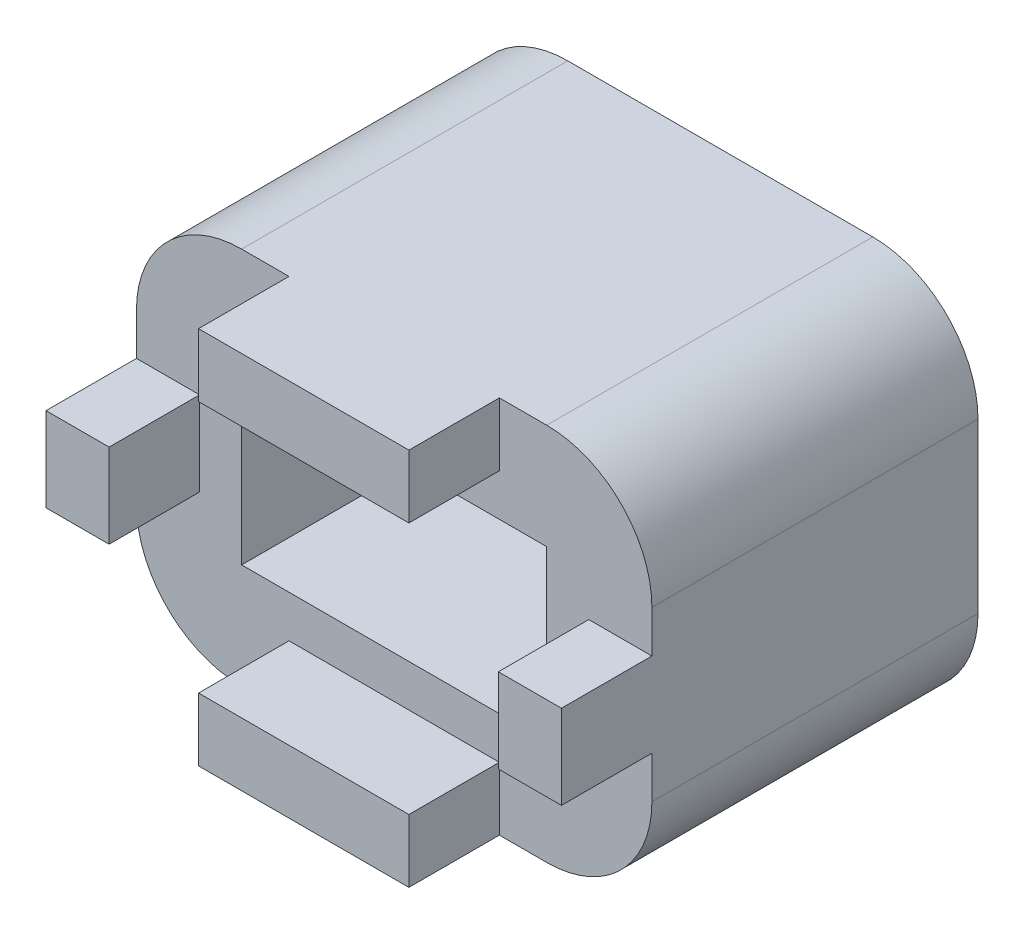
ISO-10303-21;
HEADER;
FILE_DESCRIPTION(('STEP AP214'),'2;1');
FILE_NAME('part.step','',(''),(''),'','','');
FILE_SCHEMA(('AUTOMOTIVE_DESIGN { 1 0 10303 214 1 1 1 1 }'));
ENDSEC;
DATA;
#1=APPLICATION_CONTEXT('core data for automotive mechanical design processes');
#2=APPLICATION_PROTOCOL_DEFINITION('international standard','automotive_design',2000,#1);
#3=PRODUCT_CONTEXT('',#1,'mechanical');
#4=PRODUCT('Part','Part','',(#3));
#5=PRODUCT_RELATED_PRODUCT_CATEGORY('part','',(#4));
#6=PRODUCT_DEFINITION_FORMATION('','',#4);
#7=PRODUCT_DEFINITION_CONTEXT('part definition',#1,'design');
#8=PRODUCT_DEFINITION('design','',#6,#7);
#9=PRODUCT_DEFINITION_SHAPE('','',#8);
#10=(LENGTH_UNIT() NAMED_UNIT(*) SI_UNIT(.MILLI.,.METRE.));
#11=(NAMED_UNIT(*) PLANE_ANGLE_UNIT() SI_UNIT($,.RADIAN.));
#12=(NAMED_UNIT(*) SI_UNIT($,.STERADIAN.) SOLID_ANGLE_UNIT());
#13=UNCERTAINTY_MEASURE_WITH_UNIT(LENGTH_MEASURE(1.E-05),#10,'distance_accuracy_value','');
#14=(GEOMETRIC_REPRESENTATION_CONTEXT(3) GLOBAL_UNCERTAINTY_ASSIGNED_CONTEXT((#13)) GLOBAL_UNIT_ASSIGNED_CONTEXT((#10,
#11,#12)) REPRESENTATION_CONTEXT('',''));
#15=CARTESIAN_POINT('',(0.,0.,0.));
#16=DIRECTION('',(0.,0.,1.));
#17=DIRECTION('',(1.,0.,0.));
#18=AXIS2_PLACEMENT_3D('',#15,#16,#17);
#19=CARTESIAN_POINT('',(0.,0.,15.5));
#20=DIRECTION('',(0.,0.,-1.));
#21=DIRECTION('',(-1.,0.,0.));
#22=AXIS2_PLACEMENT_3D('',#19,#20,#21);
#23=PLANE('',#22);
#24=DIRECTION('',(0.,1.,0.));
#25=VECTOR('',#24,1.);
#26=CARTESIAN_POINT('',(7.25,-4.,15.5));
#27=LINE('',#26,#25);
#28=CARTESIAN_POINT('',(7.25,-4.,15.5));
#29=VERTEX_POINT('',#28);
#30=CARTESIAN_POINT('',(7.25,4.,15.5));
#31=VERTEX_POINT('',#30);
#32=EDGE_CURVE('E350',#29,#31,#27,.T.);
#33=ORIENTED_EDGE('',*,*,#32,.F.);
#34=DIRECTION('',(1.,0.,0.));
#35=VECTOR('',#34,1.);
#36=CARTESIAN_POINT('',(-7.25,-4.,15.5));
#37=LINE('',#36,#35);
#38=CARTESIAN_POINT('',(-7.25,-4.,15.5));
#39=VERTEX_POINT('',#38);
#40=EDGE_CURVE('E358',#39,#29,#37,.T.);
#41=ORIENTED_EDGE('',*,*,#40,.F.);
#42=DIRECTION('',(0.,-1.,0.));
#43=VECTOR('',#42,1.);
#44=CARTESIAN_POINT('',(-7.25,-4.,15.5));
#45=LINE('',#44,#43);
#46=CARTESIAN_POINT('',(-7.25,4.,15.5));
#47=VERTEX_POINT('',#46);
#48=EDGE_CURVE('E355',#47,#39,#45,.T.);
#49=ORIENTED_EDGE('',*,*,#48,.F.);
#50=DIRECTION('',(-1.,0.,0.));
#51=VECTOR('',#50,1.);
#52=CARTESIAN_POINT('',(-7.25,4.,15.5));
#53=LINE('',#52,#51);
#54=EDGE_CURVE('E352',#31,#47,#53,.T.);
#55=ORIENTED_EDGE('',*,*,#54,.F.);
#56=EDGE_LOOP('',(#33,#41,#49,#55));
#57=FACE_BOUND('',#56,.T.);
#58=DIRECTION('',(-1.,0.,0.));
#59=VECTOR('',#58,1.);
#60=CARTESIAN_POINT('',(12.25,2.,15.5));
#61=LINE('',#60,#59);
#62=CARTESIAN_POINT('',(12.25,2.,15.5));
#63=VERTEX_POINT('',#62);
#64=CARTESIAN_POINT('',(9.25,2.,15.5));
#65=VERTEX_POINT('',#64);
#66=EDGE_CURVE('E232',#63,#65,#61,.T.);
#67=ORIENTED_EDGE('',*,*,#66,.F.);
#68=DIRECTION('',(0.,1.,0.));
#69=VECTOR('',#68,1.);
#70=CARTESIAN_POINT('',(12.25,-9.,15.5));
#71=LINE('',#70,#69);
#72=CARTESIAN_POINT('',(12.25,4.,15.5));
#73=VERTEX_POINT('',#72);
#74=EDGE_CURVE('E220',#63,#73,#71,.T.);
#75=ORIENTED_EDGE('',*,*,#74,.T.);
#76=CARTESIAN_POINT('',(7.25,4.,15.5));
#77=DIRECTION('',(0.,0.,-1.));
#78=DIRECTION('',(-1.,0.,0.));
#79=AXIS2_PLACEMENT_3D('',#76,#77,#78);
#80=CIRCLE('',#79,5.);
#81=CARTESIAN_POINT('',(7.25,9.,15.5));
#82=VERTEX_POINT('',#81);
#83=EDGE_CURVE('E423',#73,#82,#80,.F.);
#84=ORIENTED_EDGE('',*,*,#83,.T.);
#85=DIRECTION('',(-1.,0.,0.));
#86=VECTOR('',#85,1.);
#87=CARTESIAN_POINT('',(-12.25,9.,15.5));
#88=LINE('',#87,#86);
#89=CARTESIAN_POINT('',(5.,9.,15.5));
#90=VERTEX_POINT('',#89);
#91=EDGE_CURVE('E387',#82,#90,#88,.T.);
#92=ORIENTED_EDGE('',*,*,#91,.T.);
#93=DIRECTION('',(0.,1.,0.));
#94=VECTOR('',#93,1.);
#95=CARTESIAN_POINT('',(5.,9.,15.5));
#96=LINE('',#95,#94);
#97=CARTESIAN_POINT('',(5.,6.,15.5));
#98=VERTEX_POINT('',#97);
#99=EDGE_CURVE('E309',#98,#90,#96,.T.);
#100=ORIENTED_EDGE('',*,*,#99,.F.);
#101=DIRECTION('',(1.,0.,0.));
#102=VECTOR('',#101,1.);
#103=CARTESIAN_POINT('',(5.,6.,15.5));
#104=LINE('',#103,#102);
#105=CARTESIAN_POINT('',(-5.,6.,15.5));
#106=VERTEX_POINT('',#105);
#107=EDGE_CURVE('E302',#106,#98,#104,.T.);
#108=ORIENTED_EDGE('',*,*,#107,.F.);
#109=DIRECTION('',(0.,-1.,0.));
#110=VECTOR('',#109,1.);
#111=CARTESIAN_POINT('',(-5.,9.,15.5));
#112=LINE('',#111,#110);
#113=CARTESIAN_POINT('',(-5.,9.,15.5));
#114=VERTEX_POINT('',#113);
#115=EDGE_CURVE('E305',#114,#106,#112,.T.);
#116=ORIENTED_EDGE('',*,*,#115,.F.);
#117=CARTESIAN_POINT('',(-7.25,9.,15.5));
#118=VERTEX_POINT('',#117);
#119=EDGE_CURVE('E386',#114,#118,#88,.T.);
#120=ORIENTED_EDGE('',*,*,#119,.T.);
#121=CARTESIAN_POINT('',(-7.25,4.,15.5));
#122=DIRECTION('',(0.,0.,-1.));
#123=DIRECTION('',(-1.,0.,0.));
#124=AXIS2_PLACEMENT_3D('',#121,#122,#123);
#125=CIRCLE('',#124,5.);
#126=CARTESIAN_POINT('',(-12.25,4.,15.5));
#127=VERTEX_POINT('',#126);
#128=EDGE_CURVE('E417',#118,#127,#125,.F.);
#129=ORIENTED_EDGE('',*,*,#128,.T.);
#130=DIRECTION('',(0.,-1.,0.));
#131=VECTOR('',#130,1.);
#132=CARTESIAN_POINT('',(-12.25,-9.,15.5));
#133=LINE('',#132,#131);
#134=CARTESIAN_POINT('',(-12.25,2.,15.5));
#135=VERTEX_POINT('',#134);
#136=EDGE_CURVE('E381',#127,#135,#133,.T.);
#137=ORIENTED_EDGE('',*,*,#136,.T.);
#138=DIRECTION('',(-1.,0.,0.));
#139=VECTOR('',#138,1.);
#140=CARTESIAN_POINT('',(-12.25,2.,15.5));
#141=LINE('',#140,#139);
#142=CARTESIAN_POINT('',(-9.25,2.,15.5));
#143=VERTEX_POINT('',#142);
#144=EDGE_CURVE('E272',#143,#135,#141,.T.);
#145=ORIENTED_EDGE('',*,*,#144,.F.);
#146=DIRECTION('',(0.,1.,0.));
#147=VECTOR('',#146,1.);
#148=CARTESIAN_POINT('',(-9.25,2.,15.5));
#149=LINE('',#148,#147);
#150=CARTESIAN_POINT('',(-9.25,-2.,15.5));
#151=VERTEX_POINT('',#150);
#152=EDGE_CURVE('E275',#151,#143,#149,.T.);
#153=ORIENTED_EDGE('',*,*,#152,.F.);
#154=DIRECTION('',(1.,0.,0.));
#155=VECTOR('',#154,1.);
#156=CARTESIAN_POINT('',(-12.25,-2.,15.5));
#157=LINE('',#156,#155);
#158=CARTESIAN_POINT('',(-12.25,-2.,15.5));
#159=VERTEX_POINT('',#158);
#160=EDGE_CURVE('E279',#159,#151,#157,.T.);
#161=ORIENTED_EDGE('',*,*,#160,.F.);
#162=CARTESIAN_POINT('',(-12.25,-4.,15.5));
#163=VERTEX_POINT('',#162);
#164=EDGE_CURVE('E384',#159,#163,#133,.T.);
#165=ORIENTED_EDGE('',*,*,#164,.T.);
#166=CARTESIAN_POINT('',(-7.25,-4.,15.5));
#167=DIRECTION('',(0.,0.,-1.));
#168=DIRECTION('',(-1.,0.,0.));
#169=AXIS2_PLACEMENT_3D('',#166,#167,#168);
#170=CIRCLE('',#169,5.);
#171=CARTESIAN_POINT('',(-7.25,-9.,15.5));
#172=VERTEX_POINT('',#171);
#173=EDGE_CURVE('E419',#163,#172,#170,.F.);
#174=ORIENTED_EDGE('',*,*,#173,.T.);
#175=DIRECTION('',(1.,0.,0.));
#176=VECTOR('',#175,1.);
#177=CARTESIAN_POINT('',(-12.25,-9.,15.5));
#178=LINE('',#177,#176);
#179=CARTESIAN_POINT('',(-5.,-9.,15.5));
#180=VERTEX_POINT('',#179);
#181=EDGE_CURVE('E230',#172,#180,#178,.T.);
#182=ORIENTED_EDGE('',*,*,#181,.T.);
#183=DIRECTION('',(0.,-1.,0.));
#184=VECTOR('',#183,1.);
#185=CARTESIAN_POINT('',(-5.,-9.,15.5));
#186=LINE('',#185,#184);
#187=CARTESIAN_POINT('',(-5.,-6.,15.5));
#188=VERTEX_POINT('',#187);
#189=EDGE_CURVE('E312',#188,#180,#186,.T.);
#190=ORIENTED_EDGE('',*,*,#189,.F.);
#191=DIRECTION('',(-1.,0.,0.));
#192=VECTOR('',#191,1.);
#193=CARTESIAN_POINT('',(-5.,-6.,15.5));
#194=LINE('',#193,#192);
#195=CARTESIAN_POINT('',(5.,-6.,15.5));
#196=VERTEX_POINT('',#195);
#197=EDGE_CURVE('E324',#196,#188,#194,.T.);
#198=ORIENTED_EDGE('',*,*,#197,.F.);
#199=DIRECTION('',(0.,1.,0.));
#200=VECTOR('',#199,1.);
#201=CARTESIAN_POINT('',(5.,-9.,15.5));
#202=LINE('',#201,#200);
#203=CARTESIAN_POINT('',(5.,-9.,15.5));
#204=VERTEX_POINT('',#203);
#205=EDGE_CURVE('E333',#204,#196,#202,.T.);
#206=ORIENTED_EDGE('',*,*,#205,.F.);
#207=CARTESIAN_POINT('',(7.25,-9.,15.5));
#208=VERTEX_POINT('',#207);
#209=EDGE_CURVE('E383',#204,#208,#178,.T.);
#210=ORIENTED_EDGE('',*,*,#209,.T.);
#211=CARTESIAN_POINT('',(7.25,-4.,15.5));
#212=DIRECTION('',(0.,0.,-1.));
#213=DIRECTION('',(-1.,0.,0.));
#214=AXIS2_PLACEMENT_3D('',#211,#212,#213);
#215=CIRCLE('',#214,5.);
#216=CARTESIAN_POINT('',(12.25,-4.,15.5));
#217=VERTEX_POINT('',#216);
#218=EDGE_CURVE('E421',#208,#217,#215,.F.);
#219=ORIENTED_EDGE('',*,*,#218,.T.);
#220=CARTESIAN_POINT('',(12.25,-2.,15.5));
#221=VERTEX_POINT('',#220);
#222=EDGE_CURVE('E229',#217,#221,#71,.T.);
#223=ORIENTED_EDGE('',*,*,#222,.T.);
#224=DIRECTION('',(1.,0.,0.));
#225=VECTOR('',#224,1.);
#226=CARTESIAN_POINT('',(12.25,-2.,15.5));
#227=LINE('',#226,#225);
#228=CARTESIAN_POINT('',(9.25,-2.,15.5));
#229=VERTEX_POINT('',#228);
#230=EDGE_CURVE('E56',#229,#221,#227,.T.);
#231=ORIENTED_EDGE('',*,*,#230,.F.);
#232=DIRECTION('',(0.,-1.,0.));
#233=VECTOR('',#232,1.);
#234=CARTESIAN_POINT('',(9.25,2.,15.5));
#235=LINE('',#234,#233);
#236=EDGE_CURVE('E51',#65,#229,#235,.T.);
#237=ORIENTED_EDGE('',*,*,#236,.F.);
#238=EDGE_LOOP('',(#67,#75,#84,#92,#100,#108,#116,#120,#129,#137,#145,#153,#161,#165,#174,#182,
#190,#198,#206,#210,#219,#223,#231,#237));
#239=FACE_BOUND('',#238,.T.);
#240=ADVANCED_FACE('F36',(#57,#239),#23,.F.);
#241=CARTESIAN_POINT('',(0.,0.,0.));
#242=DIRECTION('',(0.,0.,-1.));
#243=DIRECTION('',(-1.,0.,0.));
#244=AXIS2_PLACEMENT_3D('',#241,#242,#243);
#245=PLANE('',#244);
#246=DIRECTION('',(-1.,0.,0.));
#247=VECTOR('',#246,1.);
#248=CARTESIAN_POINT('',(-12.25,9.,0.));
#249=LINE('',#248,#247);
#250=CARTESIAN_POINT('',(7.25,9.,0.));
#251=VERTEX_POINT('',#250);
#252=CARTESIAN_POINT('',(-7.25,9.,0.));
#253=VERTEX_POINT('',#252);
#254=EDGE_CURVE('E397',#251,#253,#249,.T.);
#255=ORIENTED_EDGE('',*,*,#254,.F.);
#256=CARTESIAN_POINT('',(7.25,4.,0.));
#257=DIRECTION('',(0.,0.,-1.));
#258=DIRECTION('',(-1.,0.,0.));
#259=AXIS2_PLACEMENT_3D('',#256,#257,#258);
#260=CIRCLE('',#259,5.);
#261=CARTESIAN_POINT('',(12.25,4.,0.));
#262=VERTEX_POINT('',#261);
#263=EDGE_CURVE('E411',#251,#262,#260,.T.);
#264=ORIENTED_EDGE('',*,*,#263,.T.);
#265=DIRECTION('',(0.,1.,0.));
#266=VECTOR('',#265,1.);
#267=CARTESIAN_POINT('',(12.25,-9.,0.));
#268=LINE('',#267,#266);
#269=CARTESIAN_POINT('',(12.25,-4.,0.));
#270=VERTEX_POINT('',#269);
#271=EDGE_CURVE('E395',#270,#262,#268,.T.);
#272=ORIENTED_EDGE('',*,*,#271,.F.);
#273=CARTESIAN_POINT('',(7.25,-4.,0.));
#274=DIRECTION('',(0.,0.,-1.));
#275=DIRECTION('',(-1.,0.,0.));
#276=AXIS2_PLACEMENT_3D('',#273,#274,#275);
#277=CIRCLE('',#276,5.);
#278=CARTESIAN_POINT('',(7.25,-9.,0.));
#279=VERTEX_POINT('',#278);
#280=EDGE_CURVE('E409',#270,#279,#277,.T.);
#281=ORIENTED_EDGE('',*,*,#280,.T.);
#282=DIRECTION('',(1.,0.,0.));
#283=VECTOR('',#282,1.);
#284=CARTESIAN_POINT('',(-12.25,-9.,0.));
#285=LINE('',#284,#283);
#286=CARTESIAN_POINT('',(-7.25,-9.,0.));
#287=VERTEX_POINT('',#286);
#288=EDGE_CURVE('E392',#287,#279,#285,.T.);
#289=ORIENTED_EDGE('',*,*,#288,.F.);
#290=CARTESIAN_POINT('',(-7.25,-4.,0.));
#291=DIRECTION('',(0.,0.,-1.));
#292=DIRECTION('',(-1.,0.,0.));
#293=AXIS2_PLACEMENT_3D('',#290,#291,#292);
#294=CIRCLE('',#293,5.);
#295=CARTESIAN_POINT('',(-12.25,-4.,0.));
#296=VERTEX_POINT('',#295);
#297=EDGE_CURVE('E407',#287,#296,#294,.T.);
#298=ORIENTED_EDGE('',*,*,#297,.T.);
#299=DIRECTION('',(0.,-1.,0.));
#300=VECTOR('',#299,1.);
#301=CARTESIAN_POINT('',(-12.25,-9.,0.));
#302=LINE('',#301,#300);
#303=CARTESIAN_POINT('',(-12.25,4.,0.));
#304=VERTEX_POINT('',#303);
#305=EDGE_CURVE('E380',#304,#296,#302,.T.);
#306=ORIENTED_EDGE('',*,*,#305,.F.);
#307=CARTESIAN_POINT('',(-7.25,4.,0.));
#308=DIRECTION('',(0.,0.,-1.));
#309=DIRECTION('',(-1.,0.,0.));
#310=AXIS2_PLACEMENT_3D('',#307,#308,#309);
#311=CIRCLE('',#310,5.);
#312=EDGE_CURVE('E405',#304,#253,#311,.T.);
#313=ORIENTED_EDGE('',*,*,#312,.T.);
#314=EDGE_LOOP('',(#255,#264,#272,#281,#289,#298,#306,#313));
#315=FACE_BOUND('',#314,.T.);
#316=DIRECTION('',(1.,0.,0.));
#317=VECTOR('',#316,1.);
#318=CARTESIAN_POINT('',(-7.25,-4.,0.));
#319=LINE('',#318,#317);
#320=CARTESIAN_POINT('',(-7.25,-4.,0.));
#321=VERTEX_POINT('',#320);
#322=CARTESIAN_POINT('',(7.25,-4.,0.));
#323=VERTEX_POINT('',#322);
#324=EDGE_CURVE('E353',#321,#323,#319,.T.);
#325=ORIENTED_EDGE('',*,*,#324,.T.);
#326=DIRECTION('',(0.,1.,0.));
#327=VECTOR('',#326,1.);
#328=CARTESIAN_POINT('',(7.25,-4.,0.));
#329=LINE('',#328,#327);
#330=CARTESIAN_POINT('',(7.25,4.,0.));
#331=VERTEX_POINT('',#330);
#332=EDGE_CURVE('E349',#323,#331,#329,.T.);
#333=ORIENTED_EDGE('',*,*,#332,.T.);
#334=DIRECTION('',(-1.,0.,0.));
#335=VECTOR('',#334,1.);
#336=CARTESIAN_POINT('',(-7.25,4.,0.));
#337=LINE('',#336,#335);
#338=CARTESIAN_POINT('',(-7.25,4.,0.));
#339=VERTEX_POINT('',#338);
#340=EDGE_CURVE('E363',#331,#339,#337,.T.);
#341=ORIENTED_EDGE('',*,*,#340,.T.);
#342=DIRECTION('',(0.,-1.,0.));
#343=VECTOR('',#342,1.);
#344=CARTESIAN_POINT('',(-7.25,-4.,0.));
#345=LINE('',#344,#343);
#346=EDGE_CURVE('E366',#339,#321,#345,.T.);
#347=ORIENTED_EDGE('',*,*,#346,.T.);
#348=EDGE_LOOP('',(#325,#333,#341,#347));
#349=FACE_BOUND('',#348,.T.);
#350=ADVANCED_FACE('F441',(#315,#349),#245,.T.);
#351=CARTESIAN_POINT('',(-12.25,-9.,15.5));
#352=DIRECTION('',(1.,0.,0.));
#353=DIRECTION('',(0.,0.,-1.));
#354=AXIS2_PLACEMENT_3D('',#351,#352,#353);
#355=PLANE('',#354);
#356=ORIENTED_EDGE('',*,*,#305,.T.);
#357=DIRECTION('',(0.,0.,-1.));
#358=VECTOR('',#357,1.);
#359=CARTESIAN_POINT('',(-12.25,-4.,15.5));
#360=LINE('',#359,#358);
#361=EDGE_CURVE('E11',#296,#163,#360,.F.);
#362=ORIENTED_EDGE('',*,*,#361,.T.);
#363=ORIENTED_EDGE('',*,*,#164,.F.);
#364=DIRECTION('',(0.,0.,-1.));
#365=VECTOR('',#364,1.);
#366=CARTESIAN_POINT('',(-12.25,-2.,19.8));
#367=LINE('',#366,#365);
#368=CARTESIAN_POINT('',(-12.25,-2.,19.8));
#369=VERTEX_POINT('',#368);
#370=EDGE_CURVE('E236',#369,#159,#367,.T.);
#371=ORIENTED_EDGE('',*,*,#370,.F.);
#372=DIRECTION('',(0.,-1.,0.));
#373=VECTOR('',#372,1.);
#374=CARTESIAN_POINT('',(-12.25,2.,19.8));
#375=LINE('',#374,#373);
#376=CARTESIAN_POINT('',(-12.25,2.,19.8));
#377=VERTEX_POINT('',#376);
#378=EDGE_CURVE('E276',#377,#369,#375,.T.);
#379=ORIENTED_EDGE('',*,*,#378,.F.);
#380=DIRECTION('',(0.,0.,-1.));
#381=VECTOR('',#380,1.);
#382=CARTESIAN_POINT('',(-12.25,2.,19.8));
#383=LINE('',#382,#381);
#384=EDGE_CURVE('E268',#377,#135,#383,.T.);
#385=ORIENTED_EDGE('',*,*,#384,.T.);
#386=ORIENTED_EDGE('',*,*,#136,.F.);
#387=DIRECTION('',(0.,0.,-1.));
#388=VECTOR('',#387,1.);
#389=CARTESIAN_POINT('',(-12.25,4.,15.5));
#390=LINE('',#389,#388);
#391=EDGE_CURVE('E44',#127,#304,#390,.T.);
#392=ORIENTED_EDGE('',*,*,#391,.T.);
#393=EDGE_LOOP('',(#356,#362,#363,#371,#379,#385,#386,#392));
#394=FACE_BOUND('',#393,.T.);
#395=ADVANCED_FACE('F435',(#394),#355,.F.);
#396=CARTESIAN_POINT('',(-12.25,-9.,15.5));
#397=DIRECTION('',(0.,1.,0.));
#398=DIRECTION('',(0.,0.,1.));
#399=AXIS2_PLACEMENT_3D('',#396,#397,#398);
#400=PLANE('',#399);
#401=ORIENTED_EDGE('',*,*,#288,.T.);
#402=DIRECTION('',(0.,0.,-1.));
#403=VECTOR('',#402,1.);
#404=CARTESIAN_POINT('',(7.25,-9.,15.5));
#405=LINE('',#404,#403);
#406=EDGE_CURVE('E428',#279,#208,#405,.F.);
#407=ORIENTED_EDGE('',*,*,#406,.T.);
#408=ORIENTED_EDGE('',*,*,#209,.F.);
#409=DIRECTION('',(0.,0.,-1.));
#410=VECTOR('',#409,1.);
#411=CARTESIAN_POINT('',(5.,-9.,19.8));
#412=LINE('',#411,#410);
#413=CARTESIAN_POINT('',(5.,-9.,19.8));
#414=VERTEX_POINT('',#413);
#415=EDGE_CURVE('E343',#414,#204,#412,.T.);
#416=ORIENTED_EDGE('',*,*,#415,.F.);
#417=DIRECTION('',(1.,0.,0.));
#418=VECTOR('',#417,1.);
#419=CARTESIAN_POINT('',(-5.,-9.,19.8));
#420=LINE('',#419,#418);
#421=CARTESIAN_POINT('',(-5.,-9.,19.8));
#422=VERTEX_POINT('',#421);
#423=EDGE_CURVE('E323',#422,#414,#420,.T.);
#424=ORIENTED_EDGE('',*,*,#423,.F.);
#425=DIRECTION('',(0.,0.,-1.));
#426=VECTOR('',#425,1.);
#427=CARTESIAN_POINT('',(-5.,-9.,19.8));
#428=LINE('',#427,#426);
#429=EDGE_CURVE('E346',#422,#180,#428,.T.);
#430=ORIENTED_EDGE('',*,*,#429,.T.);
#431=ORIENTED_EDGE('',*,*,#181,.F.);
#432=DIRECTION('',(0.,0.,-1.));
#433=VECTOR('',#432,1.);
#434=CARTESIAN_POINT('',(-7.25,-9.,15.5));
#435=LINE('',#434,#433);
#436=EDGE_CURVE('E425',#172,#287,#435,.T.);
#437=ORIENTED_EDGE('',*,*,#436,.T.);
#438=EDGE_LOOP('',(#401,#407,#408,#416,#424,#430,#431,#437));
#439=FACE_BOUND('',#438,.T.);
#440=ADVANCED_FACE('F450',(#439),#400,.F.);
#441=CARTESIAN_POINT('',(12.25,-9.,15.5));
#442=DIRECTION('',(-1.,0.,0.));
#443=DIRECTION('',(0.,0.,1.));
#444=AXIS2_PLACEMENT_3D('',#441,#442,#443);
#445=PLANE('',#444);
#446=ORIENTED_EDGE('',*,*,#271,.T.);
#447=DIRECTION('',(0.,0.,-1.));
#448=VECTOR('',#447,1.);
#449=CARTESIAN_POINT('',(12.25,4.,15.5));
#450=LINE('',#449,#448);
#451=EDGE_CURVE('E227',#262,#73,#450,.F.);
#452=ORIENTED_EDGE('',*,*,#451,.T.);
#453=ORIENTED_EDGE('',*,*,#74,.F.);
#454=DIRECTION('',(0.,0.,-1.));
#455=VECTOR('',#454,1.);
#456=CARTESIAN_POINT('',(12.25,2.,19.8));
#457=LINE('',#456,#455);
#458=CARTESIAN_POINT('',(12.25,2.,19.8));
#459=VERTEX_POINT('',#458);
#460=EDGE_CURVE('E225',#459,#63,#457,.T.);
#461=ORIENTED_EDGE('',*,*,#460,.F.);
#462=DIRECTION('',(0.,1.,0.));
#463=VECTOR('',#462,1.);
#464=CARTESIAN_POINT('',(12.25,2.,19.8));
#465=LINE('',#464,#463);
#466=CARTESIAN_POINT('',(12.25,-2.,19.8));
#467=VERTEX_POINT('',#466);
#468=EDGE_CURVE('E253',#467,#459,#465,.T.);
#469=ORIENTED_EDGE('',*,*,#468,.F.);
#470=DIRECTION('',(0.,0.,-1.));
#471=VECTOR('',#470,1.);
#472=CARTESIAN_POINT('',(12.25,-2.,19.8));
#473=LINE('',#472,#471);
#474=EDGE_CURVE('E248',#467,#221,#473,.T.);
#475=ORIENTED_EDGE('',*,*,#474,.T.);
#476=ORIENTED_EDGE('',*,*,#222,.F.);
#477=DIRECTION('',(0.,0.,-1.));
#478=VECTOR('',#477,1.);
#479=CARTESIAN_POINT('',(12.25,-4.,15.5));
#480=LINE('',#479,#478);
#481=EDGE_CURVE('E413',#217,#270,#480,.T.);
#482=ORIENTED_EDGE('',*,*,#481,.T.);
#483=EDGE_LOOP('',(#446,#452,#453,#461,#469,#475,#476,#482));
#484=FACE_BOUND('',#483,.T.);
#485=ADVANCED_FACE('F222',(#484),#445,.F.);
#486=CARTESIAN_POINT('',(-12.25,9.,15.5));
#487=DIRECTION('',(0.,-1.,0.));
#488=DIRECTION('',(0.,0.,-1.));
#489=AXIS2_PLACEMENT_3D('',#486,#487,#488);
#490=PLANE('',#489);
#491=ORIENTED_EDGE('',*,*,#91,.F.);
#492=DIRECTION('',(0.,0.,-1.));
#493=VECTOR('',#492,1.);
#494=CARTESIAN_POINT('',(7.25,9.,15.5));
#495=LINE('',#494,#493);
#496=EDGE_CURVE('E402',#82,#251,#495,.T.);
#497=ORIENTED_EDGE('',*,*,#496,.T.);
#498=ORIENTED_EDGE('',*,*,#254,.T.);
#499=DIRECTION('',(0.,0.,-1.));
#500=VECTOR('',#499,1.);
#501=CARTESIAN_POINT('',(-7.25,9.,15.5));
#502=LINE('',#501,#500);
#503=EDGE_CURVE('E389',#253,#118,#502,.F.);
#504=ORIENTED_EDGE('',*,*,#503,.T.);
#505=ORIENTED_EDGE('',*,*,#119,.F.);
#506=DIRECTION('',(0.,0.,-1.));
#507=VECTOR('',#506,1.);
#508=CARTESIAN_POINT('',(-5.,9.,19.8));
#509=LINE('',#508,#507);
#510=CARTESIAN_POINT('',(-5.,9.,19.8));
#511=VERTEX_POINT('',#510);
#512=EDGE_CURVE('E292',#511,#114,#509,.T.);
#513=ORIENTED_EDGE('',*,*,#512,.F.);
#514=DIRECTION('',(-1.,0.,0.));
#515=VECTOR('',#514,1.);
#516=CARTESIAN_POINT('',(5.,9.,19.8));
#517=LINE('',#516,#515);
#518=CARTESIAN_POINT('',(5.,9.,19.8));
#519=VERTEX_POINT('',#518);
#520=EDGE_CURVE('E316',#519,#511,#517,.T.);
#521=ORIENTED_EDGE('',*,*,#520,.F.);
#522=DIRECTION('',(0.,0.,-1.));
#523=VECTOR('',#522,1.);
#524=CARTESIAN_POINT('',(5.,9.,19.8));
#525=LINE('',#524,#523);
#526=EDGE_CURVE('E282',#519,#90,#525,.T.);
#527=ORIENTED_EDGE('',*,*,#526,.T.);
#528=EDGE_LOOP('',(#491,#497,#498,#504,#505,#513,#521,#527));
#529=FACE_BOUND('',#528,.T.);
#530=ADVANCED_FACE('F490',(#529),#490,.F.);
#531=CARTESIAN_POINT('',(7.25,-4.,15.5));
#532=DIRECTION('',(-1.,0.,0.));
#533=DIRECTION('',(0.,0.,1.));
#534=AXIS2_PLACEMENT_3D('',#531,#532,#533);
#535=PLANE('',#534);
#536=ORIENTED_EDGE('',*,*,#332,.F.);
#537=DIRECTION('',(0.,0.,-1.));
#538=VECTOR('',#537,1.);
#539=CARTESIAN_POINT('',(7.25,-4.,15.5));
#540=LINE('',#539,#538);
#541=EDGE_CURVE('E360',#29,#323,#540,.T.);
#542=ORIENTED_EDGE('',*,*,#541,.F.);
#543=ORIENTED_EDGE('',*,*,#32,.T.);
#544=DIRECTION('',(0.,0.,-1.));
#545=VECTOR('',#544,1.);
#546=CARTESIAN_POINT('',(7.25,4.,15.5));
#547=LINE('',#546,#545);
#548=EDGE_CURVE('E377',#31,#331,#547,.T.);
#549=ORIENTED_EDGE('',*,*,#548,.T.);
#550=EDGE_LOOP('',(#536,#542,#543,#549));
#551=FACE_BOUND('',#550,.T.);
#552=ADVANCED_FACE('F487',(#551),#535,.T.);
#553=CARTESIAN_POINT('',(-7.25,4.,15.5));
#554=DIRECTION('',(0.,-1.,0.));
#555=DIRECTION('',(0.,0.,-1.));
#556=AXIS2_PLACEMENT_3D('',#553,#554,#555);
#557=PLANE('',#556);
#558=ORIENTED_EDGE('',*,*,#340,.F.);
#559=ORIENTED_EDGE('',*,*,#548,.F.);
#560=ORIENTED_EDGE('',*,*,#54,.T.);
#561=DIRECTION('',(0.,0.,-1.));
#562=VECTOR('',#561,1.);
#563=CARTESIAN_POINT('',(-7.25,4.,15.5));
#564=LINE('',#563,#562);
#565=EDGE_CURVE('E375',#47,#339,#564,.T.);
#566=ORIENTED_EDGE('',*,*,#565,.T.);
#567=EDGE_LOOP('',(#558,#559,#560,#566));
#568=FACE_BOUND('',#567,.T.);
#569=ADVANCED_FACE('F564',(#568),#557,.T.);
#570=CARTESIAN_POINT('',(-7.25,-4.,15.5));
#571=DIRECTION('',(1.,0.,0.));
#572=DIRECTION('',(0.,0.,-1.));
#573=AXIS2_PLACEMENT_3D('',#570,#571,#572);
#574=PLANE('',#573);
#575=ORIENTED_EDGE('',*,*,#346,.F.);
#576=ORIENTED_EDGE('',*,*,#565,.F.);
#577=ORIENTED_EDGE('',*,*,#48,.T.);
#578=DIRECTION('',(0.,0.,-1.));
#579=VECTOR('',#578,1.);
#580=CARTESIAN_POINT('',(-7.25,-4.,15.5));
#581=LINE('',#580,#579);
#582=EDGE_CURVE('E373',#39,#321,#581,.T.);
#583=ORIENTED_EDGE('',*,*,#582,.T.);
#584=EDGE_LOOP('',(#575,#576,#577,#583));
#585=FACE_BOUND('',#584,.T.);
#586=ADVANCED_FACE('F561',(#585),#574,.T.);
#587=CARTESIAN_POINT('',(-7.25,-4.,15.5));
#588=DIRECTION('',(0.,1.,0.));
#589=DIRECTION('',(0.,0.,1.));
#590=AXIS2_PLACEMENT_3D('',#587,#588,#589);
#591=PLANE('',#590);
#592=ORIENTED_EDGE('',*,*,#324,.F.);
#593=ORIENTED_EDGE('',*,*,#582,.F.);
#594=ORIENTED_EDGE('',*,*,#40,.T.);
#595=ORIENTED_EDGE('',*,*,#541,.T.);
#596=EDGE_LOOP('',(#592,#593,#594,#595));
#597=FACE_BOUND('',#596,.T.);
#598=ADVANCED_FACE('F504',(#597),#591,.T.);
#599=CARTESIAN_POINT('',(7.25,4.,15.5));
#600=DIRECTION('',(0.,0.,-1.));
#601=DIRECTION('',(-1.,0.,0.));
#602=AXIS2_PLACEMENT_3D('',#599,#600,#601);
#603=CYLINDRICAL_SURFACE('',#602,5.);
#604=ORIENTED_EDGE('',*,*,#83,.F.);
#605=ORIENTED_EDGE('',*,*,#451,.F.);
#606=ORIENTED_EDGE('',*,*,#263,.F.);
#607=ORIENTED_EDGE('',*,*,#496,.F.);
#608=EDGE_LOOP('',(#604,#605,#606,#607));
#609=FACE_BOUND('',#608,.T.);
#610=ADVANCED_FACE('F500',(#609),#603,.T.);
#611=CARTESIAN_POINT('',(7.25,-4.,15.5));
#612=DIRECTION('',(0.,0.,-1.));
#613=DIRECTION('',(-1.,0.,0.));
#614=AXIS2_PLACEMENT_3D('',#611,#612,#613);
#615=CYLINDRICAL_SURFACE('',#614,5.);
#616=ORIENTED_EDGE('',*,*,#218,.F.);
#617=ORIENTED_EDGE('',*,*,#406,.F.);
#618=ORIENTED_EDGE('',*,*,#280,.F.);
#619=ORIENTED_EDGE('',*,*,#481,.F.);
#620=EDGE_LOOP('',(#616,#617,#618,#619));
#621=FACE_BOUND('',#620,.T.);
#622=ADVANCED_FACE('F503',(#621),#615,.T.);
#623=CARTESIAN_POINT('',(-7.25,-4.,15.5));
#624=DIRECTION('',(0.,0.,-1.));
#625=DIRECTION('',(-1.,0.,0.));
#626=AXIS2_PLACEMENT_3D('',#623,#624,#625);
#627=CYLINDRICAL_SURFACE('',#626,5.);
#628=ORIENTED_EDGE('',*,*,#173,.F.);
#629=ORIENTED_EDGE('',*,*,#361,.F.);
#630=ORIENTED_EDGE('',*,*,#297,.F.);
#631=ORIENTED_EDGE('',*,*,#436,.F.);
#632=EDGE_LOOP('',(#628,#629,#630,#631));
#633=FACE_BOUND('',#632,.T.);
#634=ADVANCED_FACE('F447',(#633),#627,.T.);
#635=CARTESIAN_POINT('',(-7.25,4.,15.5));
#636=DIRECTION('',(0.,0.,-1.));
#637=DIRECTION('',(-1.,0.,0.));
#638=AXIS2_PLACEMENT_3D('',#635,#636,#637);
#639=CYLINDRICAL_SURFACE('',#638,5.);
#640=ORIENTED_EDGE('',*,*,#128,.F.);
#641=ORIENTED_EDGE('',*,*,#503,.F.);
#642=ORIENTED_EDGE('',*,*,#312,.F.);
#643=ORIENTED_EDGE('',*,*,#391,.F.);
#644=EDGE_LOOP('',(#640,#641,#642,#643));
#645=FACE_BOUND('',#644,.T.);
#646=ADVANCED_FACE('F38',(#645),#639,.T.);
#647=CARTESIAN_POINT('',(-5.,-9.,19.8));
#648=DIRECTION('',(1.,0.,0.));
#649=DIRECTION('',(0.,0.,-1.));
#650=AXIS2_PLACEMENT_3D('',#647,#648,#649);
#651=PLANE('',#650);
#652=ORIENTED_EDGE('',*,*,#189,.T.);
#653=ORIENTED_EDGE('',*,*,#429,.F.);
#654=DIRECTION('',(0.,-1.,0.));
#655=VECTOR('',#654,1.);
#656=CARTESIAN_POINT('',(-5.,-9.,19.8));
#657=LINE('',#656,#655);
#658=CARTESIAN_POINT('',(-5.,-6.,19.8));
#659=VERTEX_POINT('',#658);
#660=EDGE_CURVE('E320',#659,#422,#657,.T.);
#661=ORIENTED_EDGE('',*,*,#660,.F.);
#662=DIRECTION('',(0.,0.,-1.));
#663=VECTOR('',#662,1.);
#664=CARTESIAN_POINT('',(-5.,-6.,19.8));
#665=LINE('',#664,#663);
#666=EDGE_CURVE('E330',#659,#188,#665,.T.);
#667=ORIENTED_EDGE('',*,*,#666,.T.);
#668=EDGE_LOOP('',(#652,#653,#661,#667));
#669=FACE_BOUND('',#668,.T.);
#670=ADVANCED_FACE('F512',(#669),#651,.F.);
#671=CARTESIAN_POINT('',(5.,-9.,19.8));
#672=DIRECTION('',(-1.,0.,0.));
#673=DIRECTION('',(0.,0.,1.));
#674=AXIS2_PLACEMENT_3D('',#671,#672,#673);
#675=PLANE('',#674);
#676=ORIENTED_EDGE('',*,*,#205,.T.);
#677=DIRECTION('',(0.,0.,-1.));
#678=VECTOR('',#677,1.);
#679=CARTESIAN_POINT('',(5.,-6.,19.8));
#680=LINE('',#679,#678);
#681=CARTESIAN_POINT('',(5.,-6.,19.8));
#682=VERTEX_POINT('',#681);
#683=EDGE_CURVE('E340',#682,#196,#680,.T.);
#684=ORIENTED_EDGE('',*,*,#683,.F.);
#685=DIRECTION('',(0.,1.,0.));
#686=VECTOR('',#685,1.);
#687=CARTESIAN_POINT('',(5.,-9.,19.8));
#688=LINE('',#687,#686);
#689=EDGE_CURVE('E326',#414,#682,#688,.T.);
#690=ORIENTED_EDGE('',*,*,#689,.F.);
#691=ORIENTED_EDGE('',*,*,#415,.T.);
#692=EDGE_LOOP('',(#676,#684,#690,#691));
#693=FACE_BOUND('',#692,.T.);
#694=ADVANCED_FACE('F516',(#693),#675,.F.);
#695=CARTESIAN_POINT('',(-5.,-6.,19.8));
#696=DIRECTION('',(0.,-1.,0.));
#697=DIRECTION('',(0.,0.,-1.));
#698=AXIS2_PLACEMENT_3D('',#695,#696,#697);
#699=PLANE('',#698);
#700=ORIENTED_EDGE('',*,*,#197,.T.);
#701=ORIENTED_EDGE('',*,*,#666,.F.);
#702=DIRECTION('',(-1.,0.,0.));
#703=VECTOR('',#702,1.);
#704=CARTESIAN_POINT('',(-5.,-6.,19.8));
#705=LINE('',#704,#703);
#706=EDGE_CURVE('E328',#682,#659,#705,.T.);
#707=ORIENTED_EDGE('',*,*,#706,.F.);
#708=ORIENTED_EDGE('',*,*,#683,.T.);
#709=EDGE_LOOP('',(#700,#701,#707,#708));
#710=FACE_BOUND('',#709,.T.);
#711=ADVANCED_FACE('F551',(#710),#699,.F.);
#712=CARTESIAN_POINT('',(0.,0.,19.8));
#713=DIRECTION('',(0.,0.,-1.));
#714=DIRECTION('',(-1.,0.,0.));
#715=AXIS2_PLACEMENT_3D('',#712,#713,#714);
#716=PLANE('',#715);
#717=ORIENTED_EDGE('',*,*,#660,.T.);
#718=ORIENTED_EDGE('',*,*,#423,.T.);
#719=ORIENTED_EDGE('',*,*,#689,.T.);
#720=ORIENTED_EDGE('',*,*,#706,.T.);
#721=EDGE_LOOP('',(#717,#718,#719,#720));
#722=FACE_BOUND('',#721,.T.);
#723=ADVANCED_FACE('F548',(#722),#716,.F.);
#724=CARTESIAN_POINT('',(5.,9.,19.8));
#725=DIRECTION('',(-1.,0.,0.));
#726=DIRECTION('',(0.,-1.,0.));
#727=AXIS2_PLACEMENT_3D('',#724,#725,#726);
#728=PLANE('',#727);
#729=ORIENTED_EDGE('',*,*,#99,.T.);
#730=ORIENTED_EDGE('',*,*,#526,.F.);
#731=DIRECTION('',(0.,1.,0.));
#732=VECTOR('',#731,1.);
#733=CARTESIAN_POINT('',(5.,9.,19.8));
#734=LINE('',#733,#732);
#735=CARTESIAN_POINT('',(5.,6.,19.8));
#736=VERTEX_POINT('',#735);
#737=EDGE_CURVE('E306',#736,#519,#734,.T.);
#738=ORIENTED_EDGE('',*,*,#737,.F.);
#739=DIRECTION('',(0.,0.,-1.));
#740=VECTOR('',#739,1.);
#741=CARTESIAN_POINT('',(5.,6.,19.8));
#742=LINE('',#741,#740);
#743=EDGE_CURVE('E298',#736,#98,#742,.T.);
#744=ORIENTED_EDGE('',*,*,#743,.T.);
#745=EDGE_LOOP('',(#729,#730,#738,#744));
#746=FACE_BOUND('',#745,.T.);
#747=ADVANCED_FACE('F530',(#746),#728,.F.);
#748=CARTESIAN_POINT('',(-5.,9.,19.8));
#749=DIRECTION('',(1.,0.,0.));
#750=DIRECTION('',(0.,1.,0.));
#751=AXIS2_PLACEMENT_3D('',#748,#749,#750);
#752=PLANE('',#751);
#753=ORIENTED_EDGE('',*,*,#115,.T.);
#754=DIRECTION('',(0.,0.,-1.));
#755=VECTOR('',#754,1.);
#756=CARTESIAN_POINT('',(-5.,6.,19.8));
#757=LINE('',#756,#755);
#758=CARTESIAN_POINT('',(-5.,6.,19.8));
#759=VERTEX_POINT('',#758);
#760=EDGE_CURVE('E295',#759,#106,#757,.T.);
#761=ORIENTED_EDGE('',*,*,#760,.F.);
#762=DIRECTION('',(0.,-1.,0.));
#763=VECTOR('',#762,1.);
#764=CARTESIAN_POINT('',(-5.,9.,19.8));
#765=LINE('',#764,#763);
#766=EDGE_CURVE('E314',#511,#759,#765,.T.);
#767=ORIENTED_EDGE('',*,*,#766,.F.);
#768=ORIENTED_EDGE('',*,*,#512,.T.);
#769=EDGE_LOOP('',(#753,#761,#767,#768));
#770=FACE_BOUND('',#769,.T.);
#771=ADVANCED_FACE('F538',(#770),#752,.F.);
#772=CARTESIAN_POINT('',(5.,6.,19.8));
#773=DIRECTION('',(0.,1.,0.));
#774=DIRECTION('',(0.,0.,1.));
#775=AXIS2_PLACEMENT_3D('',#772,#773,#774);
#776=PLANE('',#775);
#777=ORIENTED_EDGE('',*,*,#107,.T.);
#778=ORIENTED_EDGE('',*,*,#743,.F.);
#779=DIRECTION('',(1.,0.,0.));
#780=VECTOR('',#779,1.);
#781=CARTESIAN_POINT('',(5.,6.,19.8));
#782=LINE('',#781,#780);
#783=EDGE_CURVE('E301',#759,#736,#782,.T.);
#784=ORIENTED_EDGE('',*,*,#783,.F.);
#785=ORIENTED_EDGE('',*,*,#760,.T.);
#786=EDGE_LOOP('',(#777,#778,#784,#785));
#787=FACE_BOUND('',#786,.T.);
#788=ADVANCED_FACE('F533',(#787),#776,.F.);
#789=CARTESIAN_POINT('',(0.,0.,19.8));
#790=DIRECTION('',(0.,0.,-1.));
#791=DIRECTION('',(-1.,0.,0.));
#792=AXIS2_PLACEMENT_3D('',#789,#790,#791);
#793=PLANE('',#792);
#794=ORIENTED_EDGE('',*,*,#737,.T.);
#795=ORIENTED_EDGE('',*,*,#520,.T.);
#796=ORIENTED_EDGE('',*,*,#766,.T.);
#797=ORIENTED_EDGE('',*,*,#783,.T.);
#798=EDGE_LOOP('',(#794,#795,#796,#797));
#799=FACE_BOUND('',#798,.T.);
#800=ADVANCED_FACE('F476',(#799),#793,.F.);
#801=CARTESIAN_POINT('',(-12.25,-2.,19.8));
#802=DIRECTION('',(0.,1.,0.));
#803=DIRECTION('',(-1.,0.,0.));
#804=AXIS2_PLACEMENT_3D('',#801,#802,#803);
#805=PLANE('',#804);
#806=ORIENTED_EDGE('',*,*,#160,.T.);
#807=DIRECTION('',(0.,0.,-1.));
#808=VECTOR('',#807,1.);
#809=CARTESIAN_POINT('',(-9.25,-2.,19.8));
#810=LINE('',#809,#808);
#811=CARTESIAN_POINT('',(-9.25,-2.,19.8));
#812=VERTEX_POINT('',#811);
#813=EDGE_CURVE('E262',#812,#151,#810,.T.);
#814=ORIENTED_EDGE('',*,*,#813,.F.);
#815=DIRECTION('',(1.,0.,0.));
#816=VECTOR('',#815,1.);
#817=CARTESIAN_POINT('',(-12.25,-2.,19.8));
#818=LINE('',#817,#816);
#819=EDGE_CURVE('E286',#369,#812,#818,.T.);
#820=ORIENTED_EDGE('',*,*,#819,.F.);
#821=ORIENTED_EDGE('',*,*,#370,.T.);
#822=EDGE_LOOP('',(#806,#814,#820,#821));
#823=FACE_BOUND('',#822,.T.);
#824=ADVANCED_FACE('F457',(#823),#805,.F.);
#825=CARTESIAN_POINT('',(-9.25,2.,19.8));
#826=DIRECTION('',(-1.,0.,0.));
#827=DIRECTION('',(0.,0.,1.));
#828=AXIS2_PLACEMENT_3D('',#825,#826,#827);
#829=PLANE('',#828);
#830=ORIENTED_EDGE('',*,*,#152,.T.);
#831=DIRECTION('',(0.,0.,-1.));
#832=VECTOR('',#831,1.);
#833=CARTESIAN_POINT('',(-9.25,2.,19.8));
#834=LINE('',#833,#832);
#835=CARTESIAN_POINT('',(-9.25,2.,19.8));
#836=VERTEX_POINT('',#835);
#837=EDGE_CURVE('E265',#836,#143,#834,.T.);
#838=ORIENTED_EDGE('',*,*,#837,.F.);
#839=DIRECTION('',(0.,1.,0.));
#840=VECTOR('',#839,1.);
#841=CARTESIAN_POINT('',(-9.25,2.,19.8));
#842=LINE('',#841,#840);
#843=EDGE_CURVE('E284',#812,#836,#842,.T.);
#844=ORIENTED_EDGE('',*,*,#843,.F.);
#845=ORIENTED_EDGE('',*,*,#813,.T.);
#846=EDGE_LOOP('',(#830,#838,#844,#845));
#847=FACE_BOUND('',#846,.T.);
#848=ADVANCED_FACE('F468',(#847),#829,.F.);
#849=CARTESIAN_POINT('',(-12.25,2.,19.8));
#850=DIRECTION('',(0.,-1.,0.));
#851=DIRECTION('',(0.,0.,-1.));
#852=AXIS2_PLACEMENT_3D('',#849,#850,#851);
#853=PLANE('',#852);
#854=ORIENTED_EDGE('',*,*,#144,.T.);
#855=ORIENTED_EDGE('',*,*,#384,.F.);
#856=DIRECTION('',(-1.,0.,0.));
#857=VECTOR('',#856,1.);
#858=CARTESIAN_POINT('',(-12.25,2.,19.8));
#859=LINE('',#858,#857);
#860=EDGE_CURVE('E271',#836,#377,#859,.T.);
#861=ORIENTED_EDGE('',*,*,#860,.F.);
#862=ORIENTED_EDGE('',*,*,#837,.T.);
#863=EDGE_LOOP('',(#854,#855,#861,#862));
#864=FACE_BOUND('',#863,.T.);
#865=ADVANCED_FACE('F466',(#864),#853,.F.);
#866=CARTESIAN_POINT('',(0.,0.,19.8));
#867=DIRECTION('',(0.,0.,1.));
#868=DIRECTION('',(1.,0.,0.));
#869=AXIS2_PLACEMENT_3D('',#866,#867,#868);
#870=PLANE('',#869);
#871=ORIENTED_EDGE('',*,*,#378,.T.);
#872=ORIENTED_EDGE('',*,*,#819,.T.);
#873=ORIENTED_EDGE('',*,*,#843,.T.);
#874=ORIENTED_EDGE('',*,*,#860,.T.);
#875=EDGE_LOOP('',(#871,#872,#873,#874));
#876=FACE_BOUND('',#875,.T.);
#877=ADVANCED_FACE('F461',(#876),#870,.T.);
#878=CARTESIAN_POINT('',(12.25,2.,19.8));
#879=DIRECTION('',(0.,-1.,0.));
#880=DIRECTION('',(0.,0.,-1.));
#881=AXIS2_PLACEMENT_3D('',#878,#879,#880);
#882=PLANE('',#881);
#883=ORIENTED_EDGE('',*,*,#66,.T.);
#884=DIRECTION('',(0.,0.,-1.));
#885=VECTOR('',#884,1.);
#886=CARTESIAN_POINT('',(9.25,2.,19.8));
#887=LINE('',#886,#885);
#888=CARTESIAN_POINT('',(9.25,2.,19.8));
#889=VERTEX_POINT('',#888);
#890=EDGE_CURVE('E241',#889,#65,#887,.T.);
#891=ORIENTED_EDGE('',*,*,#890,.F.);
#892=DIRECTION('',(-1.,0.,0.));
#893=VECTOR('',#892,1.);
#894=CARTESIAN_POINT('',(12.25,2.,19.8));
#895=LINE('',#894,#893);
#896=EDGE_CURVE('E239',#459,#889,#895,.T.);
#897=ORIENTED_EDGE('',*,*,#896,.F.);
#898=ORIENTED_EDGE('',*,*,#460,.T.);
#899=EDGE_LOOP('',(#883,#891,#897,#898));
#900=FACE_BOUND('',#899,.T.);
#901=ADVANCED_FACE('F238',(#900),#882,.F.);
#902=CARTESIAN_POINT('',(9.25,2.,19.8));
#903=DIRECTION('',(1.,0.,0.));
#904=DIRECTION('',(0.,0.,-1.));
#905=AXIS2_PLACEMENT_3D('',#902,#903,#904);
#906=PLANE('',#905);
#907=ORIENTED_EDGE('',*,*,#236,.T.);
#908=DIRECTION('',(0.,0.,-1.));
#909=VECTOR('',#908,1.);
#910=CARTESIAN_POINT('',(9.25,-2.,19.8));
#911=LINE('',#910,#909);
#912=CARTESIAN_POINT('',(9.25,-2.,19.8));
#913=VERTEX_POINT('',#912);
#914=EDGE_CURVE('E243',#913,#229,#911,.T.);
#915=ORIENTED_EDGE('',*,*,#914,.F.);
#916=DIRECTION('',(0.,-1.,0.));
#917=VECTOR('',#916,1.);
#918=CARTESIAN_POINT('',(9.25,2.,19.8));
#919=LINE('',#918,#917);
#920=EDGE_CURVE('E256',#889,#913,#919,.T.);
#921=ORIENTED_EDGE('',*,*,#920,.F.);
#922=ORIENTED_EDGE('',*,*,#890,.T.);
#923=EDGE_LOOP('',(#907,#915,#921,#922));
#924=FACE_BOUND('',#923,.T.);
#925=ADVANCED_FACE('F759',(#924),#906,.F.);
#926=CARTESIAN_POINT('',(12.25,-2.,19.8));
#927=DIRECTION('',(0.,1.,0.));
#928=DIRECTION('',(0.,0.,1.));
#929=AXIS2_PLACEMENT_3D('',#926,#927,#928);
#930=PLANE('',#929);
#931=ORIENTED_EDGE('',*,*,#230,.T.);
#932=ORIENTED_EDGE('',*,*,#474,.F.);
#933=DIRECTION('',(1.,0.,0.));
#934=VECTOR('',#933,1.);
#935=CARTESIAN_POINT('',(12.25,-2.,19.8));
#936=LINE('',#935,#934);
#937=EDGE_CURVE('E251',#913,#467,#936,.T.);
#938=ORIENTED_EDGE('',*,*,#937,.F.);
#939=ORIENTED_EDGE('',*,*,#914,.T.);
#940=EDGE_LOOP('',(#931,#932,#938,#939));
#941=FACE_BOUND('',#940,.T.);
#942=ADVANCED_FACE('F769',(#941),#930,.F.);
#943=CARTESIAN_POINT('',(0.,0.,19.8));
#944=DIRECTION('',(0.,0.,-1.));
#945=DIRECTION('',(-1.,0.,0.));
#946=AXIS2_PLACEMENT_3D('',#943,#944,#945);
#947=PLANE('',#946);
#948=ORIENTED_EDGE('',*,*,#468,.T.);
#949=ORIENTED_EDGE('',*,*,#896,.T.);
#950=ORIENTED_EDGE('',*,*,#920,.T.);
#951=ORIENTED_EDGE('',*,*,#937,.T.);
#952=EDGE_LOOP('',(#948,#949,#950,#951));
#953=FACE_BOUND('',#952,.T.);
#954=ADVANCED_FACE('F780',(#953),#947,.F.);
#955=CLOSED_SHELL('',(#240,#350,#395,#440,#485,#530,#552,#569,#586,#598,#610,#622,#634,#646,
#670,#694,#711,#723,#747,#771,#788,#800,#824,#848,#865,#877,#901,#925,#942,#954));
#956=MANIFOLD_SOLID_BREP('B2',#955);
#957=ADVANCED_BREP_SHAPE_REPRESENTATION('',(#18,#956),#14);
#958=SHAPE_DEFINITION_REPRESENTATION(#9,#957);
ENDSEC;
END-ISO-10303-21;
